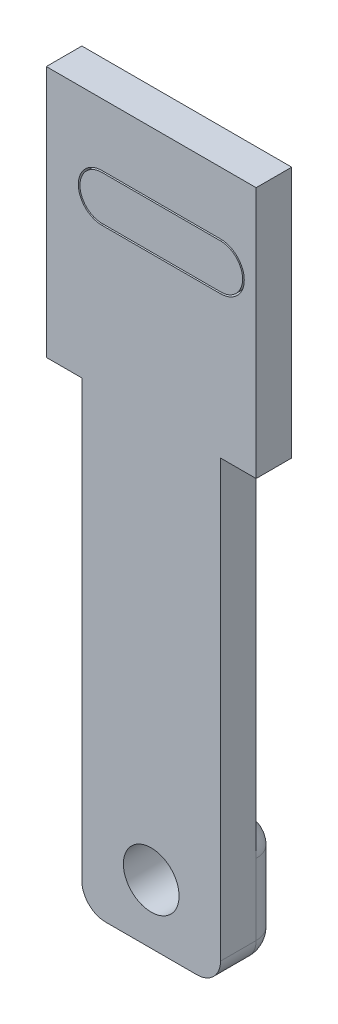
ISO-10303-21;
HEADER;
FILE_DESCRIPTION(('STEP AP214'),'2;1');
FILE_NAME('part.step','',(''),(''),'','','');
FILE_SCHEMA(('AUTOMOTIVE_DESIGN { 1 0 10303 214 1 1 1 1 }'));
ENDSEC;
DATA;
#1=APPLICATION_CONTEXT('core data for automotive mechanical design processes');
#2=APPLICATION_PROTOCOL_DEFINITION('international standard','automotive_design',2000,#1);
#3=PRODUCT_CONTEXT('',#1,'mechanical');
#4=PRODUCT('Part','Part','',(#3));
#5=PRODUCT_RELATED_PRODUCT_CATEGORY('part','',(#4));
#6=PRODUCT_DEFINITION_FORMATION('','',#4);
#7=PRODUCT_DEFINITION_CONTEXT('part definition',#1,'design');
#8=PRODUCT_DEFINITION('design','',#6,#7);
#9=PRODUCT_DEFINITION_SHAPE('','',#8);
#10=(LENGTH_UNIT() NAMED_UNIT(*) SI_UNIT(.MILLI.,.METRE.));
#11=(NAMED_UNIT(*) PLANE_ANGLE_UNIT() SI_UNIT($,.RADIAN.));
#12=(NAMED_UNIT(*) SI_UNIT($,.STERADIAN.) SOLID_ANGLE_UNIT());
#13=UNCERTAINTY_MEASURE_WITH_UNIT(LENGTH_MEASURE(1.E-05),#10,'distance_accuracy_value','');
#14=(GEOMETRIC_REPRESENTATION_CONTEXT(3) GLOBAL_UNCERTAINTY_ASSIGNED_CONTEXT((#13)) GLOBAL_UNIT_ASSIGNED_CONTEXT((#10,
#11,#12)) REPRESENTATION_CONTEXT('',''));
#15=CARTESIAN_POINT('',(0.,0.,0.));
#16=DIRECTION('',(0.,0.,1.));
#17=DIRECTION('',(1.,0.,0.));
#18=AXIS2_PLACEMENT_3D('',#15,#16,#17);
#19=CARTESIAN_POINT('',(-28.7142857142857,26.775974025974,1.25));
#20=DIRECTION('',(0.,0.,1.));
#21=DIRECTION('',(1.,0.,0.));
#22=AXIS2_PLACEMENT_3D('',#19,#20,#21);
#23=CYLINDRICAL_SURFACE('',#22,1.8617225645791);
#24=CARTESIAN_POINT('',(-28.7142857142857,26.775974025974,3.));
#25=DIRECTION('',(0.,0.,1.));
#26=DIRECTION('',(1.,0.,0.));
#27=AXIS2_PLACEMENT_3D('',#24,#25,#26);
#28=CIRCLE('',#27,1.8617225645791);
#29=CARTESIAN_POINT('',(-28.7142857142857,24.9142514613949,3.));
#30=VERTEX_POINT('',#29);
#31=CARTESIAN_POINT('',(-28.7142857142857,28.6376965905531,3.));
#32=VERTEX_POINT('',#31);
#33=EDGE_CURVE('E115',#30,#32,#28,.T.);
#34=ORIENTED_EDGE('',*,*,#33,.F.);
#35=DIRECTION('',(0.,0.,1.));
#36=VECTOR('',#35,1.);
#37=CARTESIAN_POINT('',(-28.7142857142857,24.9142514613949,1.25));
#38=LINE('',#37,#36);
#39=CARTESIAN_POINT('',(-28.7142857142857,24.9142514613949,1.25));
#40=VERTEX_POINT('',#39);
#41=EDGE_CURVE('E12',#40,#30,#38,.T.);
#42=ORIENTED_EDGE('',*,*,#41,.F.);
#43=CARTESIAN_POINT('',(-28.7142857142857,26.775974025974,1.25));
#44=DIRECTION('',(0.,0.,1.));
#45=DIRECTION('',(1.,0.,0.));
#46=AXIS2_PLACEMENT_3D('',#43,#44,#45);
#47=CIRCLE('',#46,1.8617225645791);
#48=CARTESIAN_POINT('',(-28.7142857142857,28.6376965905531,1.25));
#49=VERTEX_POINT('',#48);
#50=EDGE_CURVE('E109',#40,#49,#47,.T.);
#51=ORIENTED_EDGE('',*,*,#50,.T.);
#52=DIRECTION('',(0.,0.,1.));
#53=VECTOR('',#52,1.);
#54=CARTESIAN_POINT('',(-28.7142857142857,28.6376965905531,1.25));
#55=LINE('',#54,#53);
#56=EDGE_CURVE('E54',#49,#32,#55,.T.);
#57=ORIENTED_EDGE('',*,*,#56,.T.);
#58=EDGE_LOOP('',(#34,#42,#51,#57));
#59=FACE_BOUND('',#58,.T.);
#60=ADVANCED_FACE('F51',(#59),#23,.T.);
#61=CARTESIAN_POINT('',(-28.7142857142857,24.9142514613949,1.25));
#62=DIRECTION('',(0.,-1.,0.));
#63=DIRECTION('',(0.,0.,-1.));
#64=AXIS2_PLACEMENT_3D('',#61,#62,#63);
#65=PLANE('',#64);
#66=DIRECTION('',(1.,0.,0.));
#67=VECTOR('',#66,1.);
#68=CARTESIAN_POINT('',(-28.7142857142857,24.9142514613949,3.));
#69=LINE('',#68,#67);
#70=CARTESIAN_POINT('',(-38.7142857142857,24.9142514613949,3.));
#71=VERTEX_POINT('',#70);
#72=EDGE_CURVE('E111',#71,#30,#69,.T.);
#73=ORIENTED_EDGE('',*,*,#72,.F.);
#74=DIRECTION('',(0.,0.,1.));
#75=VECTOR('',#74,1.);
#76=CARTESIAN_POINT('',(-38.7142857142857,24.9142514613949,1.25));
#77=LINE('',#76,#75);
#78=CARTESIAN_POINT('',(-38.7142857142857,24.9142514613949,1.25));
#79=VERTEX_POINT('',#78);
#80=EDGE_CURVE('E60',#79,#71,#77,.T.);
#81=ORIENTED_EDGE('',*,*,#80,.F.);
#82=DIRECTION('',(1.,0.,0.));
#83=VECTOR('',#82,1.);
#84=CARTESIAN_POINT('',(-28.7142857142857,24.9142514613949,1.25));
#85=LINE('',#84,#83);
#86=EDGE_CURVE('E106',#79,#40,#85,.T.);
#87=ORIENTED_EDGE('',*,*,#86,.T.);
#88=ORIENTED_EDGE('',*,*,#41,.T.);
#89=EDGE_LOOP('',(#73,#81,#87,#88));
#90=FACE_BOUND('',#89,.T.);
#91=ADVANCED_FACE('F125',(#90),#65,.T.);
#92=CARTESIAN_POINT('',(-38.7142857142857,26.775974025974,1.25));
#93=DIRECTION('',(0.,0.,1.));
#94=DIRECTION('',(1.,0.,0.));
#95=AXIS2_PLACEMENT_3D('',#92,#93,#94);
#96=CYLINDRICAL_SURFACE('',#95,1.8617225645791);
#97=CARTESIAN_POINT('',(-38.7142857142857,26.775974025974,3.));
#98=DIRECTION('',(0.,0.,1.));
#99=DIRECTION('',(1.,0.,0.));
#100=AXIS2_PLACEMENT_3D('',#97,#98,#99);
#101=CIRCLE('',#100,1.8617225645791);
#102=CARTESIAN_POINT('',(-38.7142857142857,28.6376965905531,3.));
#103=VERTEX_POINT('',#102);
#104=EDGE_CURVE('E101',#103,#71,#101,.T.);
#105=ORIENTED_EDGE('',*,*,#104,.F.);
#106=DIRECTION('',(0.,0.,1.));
#107=VECTOR('',#106,1.);
#108=CARTESIAN_POINT('',(-38.7142857142857,28.6376965905531,1.25));
#109=LINE('',#108,#107);
#110=CARTESIAN_POINT('',(-38.7142857142857,28.6376965905531,1.25));
#111=VERTEX_POINT('',#110);
#112=EDGE_CURVE('E96',#111,#103,#109,.T.);
#113=ORIENTED_EDGE('',*,*,#112,.F.);
#114=CARTESIAN_POINT('',(-38.7142857142857,26.775974025974,1.25));
#115=DIRECTION('',(0.,0.,1.));
#116=DIRECTION('',(1.,0.,0.));
#117=AXIS2_PLACEMENT_3D('',#114,#115,#116);
#118=CIRCLE('',#117,1.8617225645791);
#119=EDGE_CURVE('E99',#111,#79,#118,.T.);
#120=ORIENTED_EDGE('',*,*,#119,.T.);
#121=ORIENTED_EDGE('',*,*,#80,.T.);
#122=EDGE_LOOP('',(#105,#113,#120,#121));
#123=FACE_BOUND('',#122,.T.);
#124=ADVANCED_FACE('F98',(#123),#96,.T.);
#125=CARTESIAN_POINT('',(-28.7142857142857,28.6376965905531,1.25));
#126=DIRECTION('',(0.,1.,0.));
#127=DIRECTION('',(0.,0.,1.));
#128=AXIS2_PLACEMENT_3D('',#125,#126,#127);
#129=PLANE('',#128);
#130=DIRECTION('',(-1.,0.,0.));
#131=VECTOR('',#130,1.);
#132=CARTESIAN_POINT('',(-28.7142857142857,28.6376965905531,3.));
#133=LINE('',#132,#131);
#134=EDGE_CURVE('E118',#32,#103,#133,.T.);
#135=ORIENTED_EDGE('',*,*,#134,.F.);
#136=ORIENTED_EDGE('',*,*,#56,.F.);
#137=DIRECTION('',(-1.,0.,0.));
#138=VECTOR('',#137,1.);
#139=CARTESIAN_POINT('',(-28.7142857142857,28.6376965905531,1.25));
#140=LINE('',#139,#138);
#141=EDGE_CURVE('E105',#49,#111,#140,.T.);
#142=ORIENTED_EDGE('',*,*,#141,.T.);
#143=ORIENTED_EDGE('',*,*,#112,.T.);
#144=EDGE_LOOP('',(#135,#136,#142,#143));
#145=FACE_BOUND('',#144,.T.);
#146=ADVANCED_FACE('F108',(#145),#129,.T.);
#147=CARTESIAN_POINT('',(-28.7142857142857,26.775974025974,1.25));
#148=DIRECTION('',(0.,0.,1.));
#149=DIRECTION('',(1.,0.,0.));
#150=AXIS2_PLACEMENT_3D('',#147,#148,#149);
#151=PLANE('',#150);
#152=ORIENTED_EDGE('',*,*,#50,.F.);
#153=ORIENTED_EDGE('',*,*,#86,.F.);
#154=ORIENTED_EDGE('',*,*,#119,.F.);
#155=ORIENTED_EDGE('',*,*,#141,.F.);
#156=EDGE_LOOP('',(#152,#153,#154,#155));
#157=FACE_BOUND('',#156,.T.);
#158=ADVANCED_FACE('F104',(#157),#151,.F.);
#159=CARTESIAN_POINT('',(-28.7142857142857,26.775974025974,3.));
#160=DIRECTION('',(0.,0.,1.));
#161=DIRECTION('',(1.,0.,0.));
#162=AXIS2_PLACEMENT_3D('',#159,#160,#161);
#163=PLANE('',#162);
#164=ORIENTED_EDGE('',*,*,#33,.T.);
#165=ORIENTED_EDGE('',*,*,#134,.T.);
#166=ORIENTED_EDGE('',*,*,#104,.T.);
#167=ORIENTED_EDGE('',*,*,#72,.T.);
#168=EDGE_LOOP('',(#164,#165,#166,#167));
#169=FACE_BOUND('',#168,.T.);
#170=ADVANCED_FACE('F124',(#169),#163,.T.);
#171=CLOSED_SHELL('',(#60,#91,#124,#146,#158,#170));
#172=MANIFOLD_SOLID_BREP('B2',#171);
#173=CARTESIAN_POINT('',(0.,0.,0.));
#174=DIRECTION('',(0.,0.,1.));
#175=DIRECTION('',(1.,0.,0.));
#176=AXIS2_PLACEMENT_3D('',#173,#174,#175);
#177=PLANE('',#176);
#178=DIRECTION('',(1.,0.,0.));
#179=VECTOR('',#178,1.);
#180=CARTESIAN_POINT('',(-28.7142857142857,25.525974025974,0.));
#181=LINE('',#180,#179);
#182=CARTESIAN_POINT('',(-38.7142857142857,25.525974025974,0.));
#183=VERTEX_POINT('',#182);
#184=CARTESIAN_POINT('',(-28.7142857142857,25.525974025974,0.));
#185=VERTEX_POINT('',#184);
#186=EDGE_CURVE('E410',#183,#185,#181,.T.);
#187=ORIENTED_EDGE('',*,*,#186,.T.);
#188=CARTESIAN_POINT('',(-28.7142857142857,26.775974025974,0.));
#189=DIRECTION('',(0.,0.,1.));
#190=DIRECTION('',(1.,0.,0.));
#191=AXIS2_PLACEMENT_3D('',#188,#189,#190);
#192=CIRCLE('',#191,1.25);
#193=CARTESIAN_POINT('',(-28.7142857142857,28.025974025974,0.));
#194=VERTEX_POINT('',#193);
#195=EDGE_CURVE('E401',#185,#194,#192,.T.);
#196=ORIENTED_EDGE('',*,*,#195,.T.);
#197=DIRECTION('',(-1.,0.,0.));
#198=VECTOR('',#197,1.);
#199=CARTESIAN_POINT('',(-28.7142857142857,28.025974025974,0.));
#200=LINE('',#199,#198);
#201=CARTESIAN_POINT('',(-38.7142857142857,28.025974025974,0.));
#202=VERTEX_POINT('',#201);
#203=EDGE_CURVE('E404',#194,#202,#200,.T.);
#204=ORIENTED_EDGE('',*,*,#203,.T.);
#205=CARTESIAN_POINT('',(-38.7142857142857,26.775974025974,0.));
#206=DIRECTION('',(0.,0.,1.));
#207=DIRECTION('',(1.,0.,0.));
#208=AXIS2_PLACEMENT_3D('',#205,#206,#207);
#209=CIRCLE('',#208,1.25);
#210=EDGE_CURVE('E407',#202,#183,#209,.T.);
#211=ORIENTED_EDGE('',*,*,#210,.T.);
#212=EDGE_LOOP('',(#187,#196,#204,#211));
#213=FACE_BOUND('',#212,.T.);
#214=DIRECTION('',(1.,0.,0.));
#215=VECTOR('',#214,1.);
#216=CARTESIAN_POINT('',(-28.7142857142857,-15.974025974026,0.));
#217=LINE('',#216,#215);
#218=CARTESIAN_POINT('',(-38.4142857142857,-15.974025974026,0.));
#219=VERTEX_POINT('',#218);
#220=CARTESIAN_POINT('',(-30.7142857142857,-15.974025974026,0.));
#221=VERTEX_POINT('',#220);
#222=EDGE_CURVE('E380',#219,#221,#217,.T.);
#223=ORIENTED_EDGE('',*,*,#222,.F.);
#224=CARTESIAN_POINT('',(-38.4142857142857,-17.974025974026,0.));
#225=DIRECTION('',(0.,0.,1.));
#226=DIRECTION('',(1.,0.,0.));
#227=AXIS2_PLACEMENT_3D('',#224,#225,#226);
#228=CIRCLE('',#227,2.);
#229=CARTESIAN_POINT('',(-40.4142857142857,-17.974025974026,0.));
#230=VERTEX_POINT('',#229);
#231=EDGE_CURVE('E49',#219,#230,#228,.T.);
#232=ORIENTED_EDGE('',*,*,#231,.T.);
#233=DIRECTION('',(0.,1.,0.));
#234=VECTOR('',#233,1.);
#235=CARTESIAN_POINT('',(-40.4142857142857,-25.974025974026,0.));
#236=LINE('',#235,#234);
#237=CARTESIAN_POINT('',(-40.4142857142857,12.775974025974,0.));
#238=VERTEX_POINT('',#237);
#239=EDGE_CURVE('E426',#230,#238,#236,.T.);
#240=ORIENTED_EDGE('',*,*,#239,.T.);
#241=DIRECTION('',(-1.,0.,0.));
#242=VECTOR('',#241,1.);
#243=CARTESIAN_POINT('',(-43.4142857142857,12.775974025974,0.));
#244=LINE('',#243,#242);
#245=CARTESIAN_POINT('',(-43.4142857142857,12.775974025974,0.));
#246=VERTEX_POINT('',#245);
#247=EDGE_CURVE('E428',#238,#246,#244,.T.);
#248=ORIENTED_EDGE('',*,*,#247,.T.);
#249=DIRECTION('',(0.,-1.,0.));
#250=VECTOR('',#249,1.);
#251=CARTESIAN_POINT('',(-43.4142857142857,34.025974025974,0.));
#252=LINE('',#251,#250);
#253=CARTESIAN_POINT('',(-43.4142857142857,34.025974025974,0.));
#254=VERTEX_POINT('',#253);
#255=EDGE_CURVE('E440',#254,#246,#252,.T.);
#256=ORIENTED_EDGE('',*,*,#255,.F.);
#257=DIRECTION('',(-1.,0.,0.));
#258=VECTOR('',#257,1.);
#259=CARTESIAN_POINT('',(-43.4142857142857,34.025974025974,0.));
#260=LINE('',#259,#258);
#261=CARTESIAN_POINT('',(-25.7142857142857,34.025974025974,0.));
#262=VERTEX_POINT('',#261);
#263=EDGE_CURVE('E460',#262,#254,#260,.T.);
#264=ORIENTED_EDGE('',*,*,#263,.F.);
#265=DIRECTION('',(0.,1.,0.));
#266=VECTOR('',#265,1.);
#267=CARTESIAN_POINT('',(-25.7142857142857,34.025974025974,0.));
#268=LINE('',#267,#266);
#269=CARTESIAN_POINT('',(-25.7142857142857,12.775974025974,0.));
#270=VERTEX_POINT('',#269);
#271=EDGE_CURVE('E469',#270,#262,#268,.T.);
#272=ORIENTED_EDGE('',*,*,#271,.F.);
#273=DIRECTION('',(-1.,0.,0.));
#274=VECTOR('',#273,1.);
#275=CARTESIAN_POINT('',(-25.7142857142857,12.775974025974,0.));
#276=LINE('',#275,#274);
#277=CARTESIAN_POINT('',(-28.7142857142857,12.775974025974,0.));
#278=VERTEX_POINT('',#277);
#279=EDGE_CURVE('E450',#270,#278,#276,.T.);
#280=ORIENTED_EDGE('',*,*,#279,.T.);
#281=DIRECTION('',(0.,-1.,0.));
#282=VECTOR('',#281,1.);
#283=CARTESIAN_POINT('',(-28.7142857142857,-25.974025974026,0.));
#284=LINE('',#283,#282);
#285=CARTESIAN_POINT('',(-28.7142857142857,-17.974025974026,0.));
#286=VERTEX_POINT('',#285);
#287=EDGE_CURVE('E445',#278,#286,#284,.T.);
#288=ORIENTED_EDGE('',*,*,#287,.T.);
#289=CARTESIAN_POINT('',(-30.7142857142857,-17.974025974026,0.));
#290=DIRECTION('',(0.,0.,1.));
#291=DIRECTION('',(1.,0.,0.));
#292=AXIS2_PLACEMENT_3D('',#289,#290,#291);
#293=CIRCLE('',#292,2.);
#294=EDGE_CURVE('E508',#286,#221,#293,.T.);
#295=ORIENTED_EDGE('',*,*,#294,.T.);
#296=EDGE_LOOP('',(#223,#232,#240,#248,#256,#264,#272,#280,#288,#295));
#297=FACE_BOUND('',#296,.T.);
#298=ADVANCED_FACE('F198',(#213,#297),#177,.F.);
#299=CARTESIAN_POINT('',(-28.7142857142857,26.775974025974,0.));
#300=DIRECTION('',(0.,0.,1.));
#301=DIRECTION('',(1.,0.,0.));
#302=AXIS2_PLACEMENT_3D('',#299,#300,#301);
#303=CYLINDRICAL_SURFACE('',#302,1.25);
#304=CARTESIAN_POINT('',(-28.7142857142857,26.775974025974,1.));
#305=DIRECTION('',(0.,0.,1.));
#306=DIRECTION('',(1.,0.,0.));
#307=AXIS2_PLACEMENT_3D('',#304,#305,#306);
#308=CIRCLE('',#307,1.25);
#309=CARTESIAN_POINT('',(-28.7142857142857,28.025974025974,1.));
#310=VERTEX_POINT('',#309);
#311=CARTESIAN_POINT('',(-28.7142857142857,25.525974025974,1.));
#312=VERTEX_POINT('',#311);
#313=EDGE_CURVE('E399',#310,#312,#308,.F.);
#314=ORIENTED_EDGE('',*,*,#313,.F.);
#315=DIRECTION('',(0.,0.,1.));
#316=VECTOR('',#315,1.);
#317=CARTESIAN_POINT('',(-28.7142857142857,28.025974025974,0.));
#318=LINE('',#317,#316);
#319=EDGE_CURVE('E413',#194,#310,#318,.T.);
#320=ORIENTED_EDGE('',*,*,#319,.F.);
#321=ORIENTED_EDGE('',*,*,#195,.F.);
#322=DIRECTION('',(0.,0.,1.));
#323=VECTOR('',#322,1.);
#324=CARTESIAN_POINT('',(-28.7142857142857,25.525974025974,0.));
#325=LINE('',#324,#323);
#326=EDGE_CURVE('E414',#185,#312,#325,.T.);
#327=ORIENTED_EDGE('',*,*,#326,.T.);
#328=EDGE_LOOP('',(#314,#320,#321,#327));
#329=FACE_BOUND('',#328,.T.);
#330=ADVANCED_FACE('F624',(#329),#303,.F.);
#331=CARTESIAN_POINT('',(-28.7142857142857,25.525974025974,0.));
#332=DIRECTION('',(0.,-1.,0.));
#333=DIRECTION('',(0.,0.,-1.));
#334=AXIS2_PLACEMENT_3D('',#331,#332,#333);
#335=PLANE('',#334);
#336=DIRECTION('',(-1.,0.,0.));
#337=VECTOR('',#336,1.);
#338=CARTESIAN_POINT('',(-28.7142857142857,25.525974025974,1.));
#339=LINE('',#338,#337);
#340=CARTESIAN_POINT('',(-38.7142857142857,25.525974025974,1.));
#341=VERTEX_POINT('',#340);
#342=EDGE_CURVE('E397',#312,#341,#339,.T.);
#343=ORIENTED_EDGE('',*,*,#342,.F.);
#344=ORIENTED_EDGE('',*,*,#326,.F.);
#345=ORIENTED_EDGE('',*,*,#186,.F.);
#346=DIRECTION('',(0.,0.,1.));
#347=VECTOR('',#346,1.);
#348=CARTESIAN_POINT('',(-38.7142857142857,25.525974025974,0.));
#349=LINE('',#348,#347);
#350=EDGE_CURVE('E418',#183,#341,#349,.T.);
#351=ORIENTED_EDGE('',*,*,#350,.T.);
#352=EDGE_LOOP('',(#343,#344,#345,#351));
#353=FACE_BOUND('',#352,.T.);
#354=ADVANCED_FACE('F629',(#353),#335,.F.);
#355=CARTESIAN_POINT('',(-38.7142857142857,26.775974025974,0.));
#356=DIRECTION('',(0.,0.,1.));
#357=DIRECTION('',(1.,0.,0.));
#358=AXIS2_PLACEMENT_3D('',#355,#356,#357);
#359=CYLINDRICAL_SURFACE('',#358,1.25);
#360=CARTESIAN_POINT('',(-38.7142857142857,26.775974025974,1.));
#361=DIRECTION('',(0.,0.,1.));
#362=DIRECTION('',(1.,0.,0.));
#363=AXIS2_PLACEMENT_3D('',#360,#361,#362);
#364=CIRCLE('',#363,1.25);
#365=CARTESIAN_POINT('',(-38.7142857142857,28.025974025974,1.));
#366=VERTEX_POINT('',#365);
#367=EDGE_CURVE('E392',#341,#366,#364,.F.);
#368=ORIENTED_EDGE('',*,*,#367,.F.);
#369=ORIENTED_EDGE('',*,*,#350,.F.);
#370=ORIENTED_EDGE('',*,*,#210,.F.);
#371=DIRECTION('',(0.,0.,1.));
#372=VECTOR('',#371,1.);
#373=CARTESIAN_POINT('',(-38.7142857142857,28.025974025974,0.));
#374=LINE('',#373,#372);
#375=EDGE_CURVE('E421',#202,#366,#374,.T.);
#376=ORIENTED_EDGE('',*,*,#375,.T.);
#377=EDGE_LOOP('',(#368,#369,#370,#376));
#378=FACE_BOUND('',#377,.T.);
#379=ADVANCED_FACE('F644',(#378),#359,.F.);
#380=CARTESIAN_POINT('',(-28.7142857142857,28.025974025974,0.));
#381=DIRECTION('',(0.,1.,0.));
#382=DIRECTION('',(-1.,0.,0.));
#383=AXIS2_PLACEMENT_3D('',#380,#381,#382);
#384=PLANE('',#383);
#385=DIRECTION('',(1.,0.,0.));
#386=VECTOR('',#385,1.);
#387=CARTESIAN_POINT('',(-28.7142857142857,28.025974025974,1.));
#388=LINE('',#387,#386);
#389=EDGE_CURVE('E477',#366,#310,#388,.T.);
#390=ORIENTED_EDGE('',*,*,#389,.F.);
#391=ORIENTED_EDGE('',*,*,#375,.F.);
#392=ORIENTED_EDGE('',*,*,#203,.F.);
#393=ORIENTED_EDGE('',*,*,#319,.T.);
#394=EDGE_LOOP('',(#390,#391,#392,#393));
#395=FACE_BOUND('',#394,.T.);
#396=ADVANCED_FACE('F641',(#395),#384,.F.);
#397=CARTESIAN_POINT('',(-43.4142857142857,34.025974025974,3.));
#398=DIRECTION('',(1.,0.,0.));
#399=DIRECTION('',(0.,1.,0.));
#400=AXIS2_PLACEMENT_3D('',#397,#398,#399);
#401=PLANE('',#400);
#402=ORIENTED_EDGE('',*,*,#255,.T.);
#403=DIRECTION('',(0.,0.,1.));
#404=VECTOR('',#403,1.);
#405=CARTESIAN_POINT('',(-43.4142857142857,12.775974025974,0.));
#406=LINE('',#405,#404);
#407=CARTESIAN_POINT('',(-43.4142857142857,12.775974025974,3.));
#408=VERTEX_POINT('',#407);
#409=EDGE_CURVE('E437',#246,#408,#406,.T.);
#410=ORIENTED_EDGE('',*,*,#409,.T.);
#411=DIRECTION('',(0.,-1.,0.));
#412=VECTOR('',#411,1.);
#413=CARTESIAN_POINT('',(-43.4142857142857,34.025974025974,3.));
#414=LINE('',#413,#412);
#415=CARTESIAN_POINT('',(-43.4142857142857,34.025974025974,3.));
#416=VERTEX_POINT('',#415);
#417=EDGE_CURVE('E456',#416,#408,#414,.T.);
#418=ORIENTED_EDGE('',*,*,#417,.F.);
#419=DIRECTION('',(0.,0.,-1.));
#420=VECTOR('',#419,1.);
#421=CARTESIAN_POINT('',(-43.4142857142857,34.025974025974,3.));
#422=LINE('',#421,#420);
#423=EDGE_CURVE('E466',#416,#254,#422,.T.);
#424=ORIENTED_EDGE('',*,*,#423,.T.);
#425=EDGE_LOOP('',(#402,#410,#418,#424));
#426=FACE_BOUND('',#425,.T.);
#427=ADVANCED_FACE('F558',(#426),#401,.F.);
#428=CARTESIAN_POINT('',(-43.4142857142857,-25.974025974026,3.));
#429=DIRECTION('',(0.,1.,0.));
#430=DIRECTION('',(0.,0.,1.));
#431=AXIS2_PLACEMENT_3D('',#428,#429,#430);
#432=PLANE('',#431);
#433=DIRECTION('',(1.,0.,0.));
#434=VECTOR('',#433,1.);
#435=CARTESIAN_POINT('',(-43.4142857142857,-25.974025974026,3.));
#436=LINE('',#435,#434);
#437=CARTESIAN_POINT('',(-38.4142857142857,-25.974025974026,3.));
#438=VERTEX_POINT('',#437);
#439=CARTESIAN_POINT('',(-30.7142857142857,-25.974025974026,3.));
#440=VERTEX_POINT('',#439);
#441=EDGE_CURVE('E459',#438,#440,#436,.T.);
#442=ORIENTED_EDGE('',*,*,#441,.F.);
#443=DIRECTION('',(0.,0.,1.));
#444=VECTOR('',#443,1.);
#445=CARTESIAN_POINT('',(-38.4142857142857,-25.974025974026,3.));
#446=LINE('',#445,#444);
#447=CARTESIAN_POINT('',(-38.4142857142857,-25.974025974026,0.));
#448=VERTEX_POINT('',#447);
#449=EDGE_CURVE('E207',#438,#448,#446,.F.);
#450=ORIENTED_EDGE('',*,*,#449,.T.);
#451=DIRECTION('',(-1.,0.,0.));
#452=VECTOR('',#451,1.);
#453=CARTESIAN_POINT('',(-43.4142857142857,-25.974025974026,0.));
#454=LINE('',#453,#452);
#455=CARTESIAN_POINT('',(-30.7142857142857,-25.974025974026,0.));
#456=VERTEX_POINT('',#455);
#457=EDGE_CURVE('E486',#448,#456,#454,.F.);
#458=ORIENTED_EDGE('',*,*,#457,.T.);
#459=DIRECTION('',(0.,0.,1.));
#460=VECTOR('',#459,1.);
#461=CARTESIAN_POINT('',(-30.7142857142857,-25.974025974026,3.));
#462=LINE('',#461,#460);
#463=EDGE_CURVE('E503',#456,#440,#462,.T.);
#464=ORIENTED_EDGE('',*,*,#463,.T.);
#465=EDGE_LOOP('',(#442,#450,#458,#464));
#466=FACE_BOUND('',#465,.T.);
#467=ADVANCED_FACE('F597',(#466),#432,.F.);
#468=CARTESIAN_POINT('',(-25.7142857142857,34.025974025974,3.));
#469=DIRECTION('',(-1.,0.,0.));
#470=DIRECTION('',(0.,-1.,0.));
#471=AXIS2_PLACEMENT_3D('',#468,#469,#470);
#472=PLANE('',#471);
#473=DIRECTION('',(0.,1.,0.));
#474=VECTOR('',#473,1.);
#475=CARTESIAN_POINT('',(-25.7142857142857,34.025974025974,3.));
#476=LINE('',#475,#474);
#477=CARTESIAN_POINT('',(-25.7142857142857,12.775974025974,3.));
#478=VERTEX_POINT('',#477);
#479=CARTESIAN_POINT('',(-25.7142857142857,34.025974025974,3.));
#480=VERTEX_POINT('',#479);
#481=EDGE_CURVE('E462',#478,#480,#476,.T.);
#482=ORIENTED_EDGE('',*,*,#481,.F.);
#483=DIRECTION('',(0.,0.,1.));
#484=VECTOR('',#483,1.);
#485=CARTESIAN_POINT('',(-25.7142857142857,12.775974025974,0.));
#486=LINE('',#485,#484);
#487=EDGE_CURVE('E443',#270,#478,#486,.T.);
#488=ORIENTED_EDGE('',*,*,#487,.F.);
#489=ORIENTED_EDGE('',*,*,#271,.T.);
#490=DIRECTION('',(0.,0.,-1.));
#491=VECTOR('',#490,1.);
#492=CARTESIAN_POINT('',(-25.7142857142857,34.025974025974,3.));
#493=LINE('',#492,#491);
#494=EDGE_CURVE('E474',#480,#262,#493,.T.);
#495=ORIENTED_EDGE('',*,*,#494,.F.);
#496=EDGE_LOOP('',(#482,#488,#489,#495));
#497=FACE_BOUND('',#496,.T.);
#498=ADVANCED_FACE('F609',(#497),#472,.F.);
#499=CARTESIAN_POINT('',(-43.4142857142857,34.025974025974,3.));
#500=DIRECTION('',(0.,-1.,0.));
#501=DIRECTION('',(0.,0.,-1.));
#502=AXIS2_PLACEMENT_3D('',#499,#500,#501);
#503=PLANE('',#502);
#504=ORIENTED_EDGE('',*,*,#263,.T.);
#505=ORIENTED_EDGE('',*,*,#423,.F.);
#506=DIRECTION('',(-1.,0.,0.));
#507=VECTOR('',#506,1.);
#508=CARTESIAN_POINT('',(-43.4142857142857,34.025974025974,3.));
#509=LINE('',#508,#507);
#510=EDGE_CURVE('E464',#480,#416,#509,.T.);
#511=ORIENTED_EDGE('',*,*,#510,.F.);
#512=ORIENTED_EDGE('',*,*,#494,.T.);
#513=EDGE_LOOP('',(#504,#505,#511,#512));
#514=FACE_BOUND('',#513,.T.);
#515=ADVANCED_FACE('F612',(#514),#503,.F.);
#516=CARTESIAN_POINT('',(0.,0.,3.));
#517=DIRECTION('',(0.,0.,1.));
#518=DIRECTION('',(1.,0.,0.));
#519=AXIS2_PLACEMENT_3D('',#516,#517,#518);
#520=PLANE('',#519);
#521=CARTESIAN_POINT('',(-34.5642857142857,-20.974025974026,3.));
#522=DIRECTION('',(0.,0.,-1.));
#523=DIRECTION('',(-1.,0.,0.));
#524=AXIS2_PLACEMENT_3D('',#521,#522,#523);
#525=CIRCLE('',#524,2.35);
#526=CARTESIAN_POINT('',(-36.9142857142857,-20.974025974026,3.));
#527=VERTEX_POINT('',#526);
#528=EDGE_CURVE('E483',#527,#527,#525,.T.);
#529=ORIENTED_EDGE('',*,*,#528,.T.);
#530=EDGE_LOOP('',(#529));
#531=FACE_BOUND('',#530,.T.);
#532=CARTESIAN_POINT('',(-38.7142857142857,26.775974025974,3.));
#533=DIRECTION('',(0.,0.,1.));
#534=DIRECTION('',(1.,0.,0.));
#535=AXIS2_PLACEMENT_3D('',#532,#533,#534);
#536=CIRCLE('',#535,2.);
#537=CARTESIAN_POINT('',(-38.7142857142857,28.775974025974,3.));
#538=VERTEX_POINT('',#537);
#539=CARTESIAN_POINT('',(-38.7142857142857,24.775974025974,3.));
#540=VERTEX_POINT('',#539);
#541=EDGE_CURVE('E356',#538,#540,#536,.T.);
#542=ORIENTED_EDGE('',*,*,#541,.F.);
#543=DIRECTION('',(-1.,0.,0.));
#544=VECTOR('',#543,1.);
#545=CARTESIAN_POINT('',(-38.7142857142857,28.775974025974,3.));
#546=LINE('',#545,#544);
#547=CARTESIAN_POINT('',(-28.7142857142857,28.775974025974,3.));
#548=VERTEX_POINT('',#547);
#549=EDGE_CURVE('E374',#548,#538,#546,.T.);
#550=ORIENTED_EDGE('',*,*,#549,.F.);
#551=CARTESIAN_POINT('',(-28.7142857142857,26.775974025974,3.));
#552=DIRECTION('',(0.,0.,1.));
#553=DIRECTION('',(1.,0.,0.));
#554=AXIS2_PLACEMENT_3D('',#551,#552,#553);
#555=CIRCLE('',#554,2.);
#556=CARTESIAN_POINT('',(-28.7142857142857,24.775974025974,3.));
#557=VERTEX_POINT('',#556);
#558=EDGE_CURVE('E377',#557,#548,#555,.T.);
#559=ORIENTED_EDGE('',*,*,#558,.F.);
#560=DIRECTION('',(1.,0.,0.));
#561=VECTOR('',#560,1.);
#562=CARTESIAN_POINT('',(-38.7142857142857,24.775974025974,3.));
#563=LINE('',#562,#561);
#564=EDGE_CURVE('E386',#540,#557,#563,.T.);
#565=ORIENTED_EDGE('',*,*,#564,.F.);
#566=EDGE_LOOP('',(#542,#550,#559,#565));
#567=FACE_BOUND('',#566,.T.);
#568=DIRECTION('',(0.,1.,0.));
#569=VECTOR('',#568,1.);
#570=CARTESIAN_POINT('',(-40.4142857142857,-25.974025974026,3.));
#571=LINE('',#570,#569);
#572=CARTESIAN_POINT('',(-40.4142857142857,-23.974025974026,3.));
#573=VERTEX_POINT('',#572);
#574=CARTESIAN_POINT('',(-40.4142857142857,12.775974025974,3.));
#575=VERTEX_POINT('',#574);
#576=EDGE_CURVE('E433',#573,#575,#571,.T.);
#577=ORIENTED_EDGE('',*,*,#576,.F.);
#578=CARTESIAN_POINT('',(-38.4142857142857,-23.974025974026,3.));
#579=DIRECTION('',(0.,0.,1.));
#580=DIRECTION('',(1.,0.,0.));
#581=AXIS2_PLACEMENT_3D('',#578,#579,#580);
#582=CIRCLE('',#581,2.);
#583=EDGE_CURVE('E215',#573,#438,#582,.T.);
#584=ORIENTED_EDGE('',*,*,#583,.T.);
#585=ORIENTED_EDGE('',*,*,#441,.T.);
#586=CARTESIAN_POINT('',(-30.7142857142857,-23.974025974026,3.));
#587=DIRECTION('',(0.,0.,1.));
#588=DIRECTION('',(1.,0.,0.));
#589=AXIS2_PLACEMENT_3D('',#586,#587,#588);
#590=CIRCLE('',#589,2.);
#591=CARTESIAN_POINT('',(-28.7142857142857,-23.974025974026,3.));
#592=VERTEX_POINT('',#591);
#593=EDGE_CURVE('E506',#440,#592,#590,.T.);
#594=ORIENTED_EDGE('',*,*,#593,.T.);
#595=DIRECTION('',(0.,-1.,0.));
#596=VECTOR('',#595,1.);
#597=CARTESIAN_POINT('',(-28.7142857142857,-25.974025974026,3.));
#598=LINE('',#597,#596);
#599=CARTESIAN_POINT('',(-28.7142857142857,12.775974025974,3.));
#600=VERTEX_POINT('',#599);
#601=EDGE_CURVE('E447',#600,#592,#598,.T.);
#602=ORIENTED_EDGE('',*,*,#601,.F.);
#603=DIRECTION('',(-1.,0.,0.));
#604=VECTOR('',#603,1.);
#605=CARTESIAN_POINT('',(-25.7142857142857,12.775974025974,3.));
#606=LINE('',#605,#604);
#607=EDGE_CURVE('E435',#478,#600,#606,.T.);
#608=ORIENTED_EDGE('',*,*,#607,.F.);
#609=ORIENTED_EDGE('',*,*,#481,.T.);
#610=ORIENTED_EDGE('',*,*,#510,.T.);
#611=ORIENTED_EDGE('',*,*,#417,.T.);
#612=DIRECTION('',(-1.,0.,0.));
#613=VECTOR('',#612,1.);
#614=CARTESIAN_POINT('',(-43.4142857142857,12.775974025974,3.));
#615=LINE('',#614,#613);
#616=EDGE_CURVE('E429',#575,#408,#615,.T.);
#617=ORIENTED_EDGE('',*,*,#616,.F.);
#618=EDGE_LOOP('',(#577,#584,#585,#594,#602,#608,#609,#610,#611,#617));
#619=FACE_BOUND('',#618,.T.);
#620=ADVANCED_FACE('F552',(#531,#567,#619),#520,.T.);
#621=CARTESIAN_POINT('',(-28.7142857142857,-25.974025974026,0.));
#622=DIRECTION('',(-1.,0.,0.));
#623=DIRECTION('',(0.,0.,1.));
#624=AXIS2_PLACEMENT_3D('',#621,#622,#623);
#625=PLANE('',#624);
#626=DIRECTION('',(0.,-1.,0.));
#627=VECTOR('',#626,1.);
#628=CARTESIAN_POINT('',(-28.7142857142857,-25.974025974026,0.));
#629=LINE('',#628,#627);
#630=CARTESIAN_POINT('',(-28.7142857142857,-23.974025974026,0.));
#631=VERTEX_POINT('',#630);
#632=EDGE_CURVE('E492',#631,#286,#629,.F.);
#633=ORIENTED_EDGE('',*,*,#632,.T.);
#634=ORIENTED_EDGE('',*,*,#287,.F.);
#635=DIRECTION('',(0.,0.,1.));
#636=VECTOR('',#635,1.);
#637=CARTESIAN_POINT('',(-28.7142857142857,12.775974025974,0.));
#638=LINE('',#637,#636);
#639=EDGE_CURVE('E417',#278,#600,#638,.T.);
#640=ORIENTED_EDGE('',*,*,#639,.T.);
#641=ORIENTED_EDGE('',*,*,#601,.T.);
#642=DIRECTION('',(0.,0.,1.));
#643=VECTOR('',#642,1.);
#644=CARTESIAN_POINT('',(-28.7142857142857,-23.974025974026,0.));
#645=LINE('',#644,#643);
#646=EDGE_CURVE('E490',#592,#631,#645,.F.);
#647=ORIENTED_EDGE('',*,*,#646,.T.);
#648=EDGE_LOOP('',(#633,#634,#640,#641,#647));
#649=FACE_BOUND('',#648,.T.);
#650=ADVANCED_FACE('F601',(#649),#625,.F.);
#651=CARTESIAN_POINT('',(-25.7142857142857,12.775974025974,0.));
#652=DIRECTION('',(0.,1.,0.));
#653=DIRECTION('',(-1.,0.,0.));
#654=AXIS2_PLACEMENT_3D('',#651,#652,#653);
#655=PLANE('',#654);
#656=ORIENTED_EDGE('',*,*,#607,.T.);
#657=ORIENTED_EDGE('',*,*,#639,.F.);
#658=ORIENTED_EDGE('',*,*,#279,.F.);
#659=ORIENTED_EDGE('',*,*,#487,.T.);
#660=EDGE_LOOP('',(#656,#657,#658,#659));
#661=FACE_BOUND('',#660,.T.);
#662=ADVANCED_FACE('F604',(#661),#655,.F.);
#663=CARTESIAN_POINT('',(-43.4142857142857,12.775974025974,0.));
#664=DIRECTION('',(0.,1.,0.));
#665=DIRECTION('',(0.,0.,1.));
#666=AXIS2_PLACEMENT_3D('',#663,#664,#665);
#667=PLANE('',#666);
#668=ORIENTED_EDGE('',*,*,#616,.T.);
#669=ORIENTED_EDGE('',*,*,#409,.F.);
#670=ORIENTED_EDGE('',*,*,#247,.F.);
#671=DIRECTION('',(0.,0.,1.));
#672=VECTOR('',#671,1.);
#673=CARTESIAN_POINT('',(-40.4142857142857,12.775974025974,0.));
#674=LINE('',#673,#672);
#675=EDGE_CURVE('E432',#238,#575,#674,.T.);
#676=ORIENTED_EDGE('',*,*,#675,.T.);
#677=EDGE_LOOP('',(#668,#669,#670,#676));
#678=FACE_BOUND('',#677,.T.);
#679=ADVANCED_FACE('F555',(#678),#667,.F.);
#680=CARTESIAN_POINT('',(-40.4142857142857,-25.974025974026,0.));
#681=DIRECTION('',(1.,0.,0.));
#682=DIRECTION('',(0.,0.,-1.));
#683=AXIS2_PLACEMENT_3D('',#680,#681,#682);
#684=PLANE('',#683);
#685=ORIENTED_EDGE('',*,*,#239,.F.);
#686=DIRECTION('',(0.,1.,0.));
#687=VECTOR('',#686,1.);
#688=CARTESIAN_POINT('',(-40.4142857142857,-25.974025974026,0.));
#689=LINE('',#688,#687);
#690=CARTESIAN_POINT('',(-40.4142857142857,-23.974025974026,0.));
#691=VERTEX_POINT('',#690);
#692=EDGE_CURVE('E525',#230,#691,#689,.F.);
#693=ORIENTED_EDGE('',*,*,#692,.T.);
#694=DIRECTION('',(0.,0.,1.));
#695=VECTOR('',#694,1.);
#696=CARTESIAN_POINT('',(-40.4142857142857,-23.974025974026,0.));
#697=LINE('',#696,#695);
#698=EDGE_CURVE('E523',#691,#573,#697,.T.);
#699=ORIENTED_EDGE('',*,*,#698,.T.);
#700=ORIENTED_EDGE('',*,*,#576,.T.);
#701=ORIENTED_EDGE('',*,*,#675,.F.);
#702=EDGE_LOOP('',(#685,#693,#699,#700,#701));
#703=FACE_BOUND('',#702,.T.);
#704=ADVANCED_FACE('F549',(#703),#684,.F.);
#705=CARTESIAN_POINT('',(-38.7142857142857,26.775974025974,1.));
#706=DIRECTION('',(0.,0.,1.));
#707=DIRECTION('',(1.,0.,0.));
#708=AXIS2_PLACEMENT_3D('',#705,#706,#707);
#709=PLANE('',#708);
#710=CARTESIAN_POINT('',(-38.7142857142857,26.775974025974,1.));
#711=DIRECTION('',(0.,0.,1.));
#712=DIRECTION('',(1.,0.,0.));
#713=AXIS2_PLACEMENT_3D('',#710,#711,#712);
#714=CIRCLE('',#713,2.);
#715=CARTESIAN_POINT('',(-38.7142857142857,28.775974025974,1.));
#716=VERTEX_POINT('',#715);
#717=CARTESIAN_POINT('',(-38.7142857142857,24.775974025974,1.));
#718=VERTEX_POINT('',#717);
#719=EDGE_CURVE('E353',#716,#718,#714,.T.);
#720=ORIENTED_EDGE('',*,*,#719,.T.);
#721=DIRECTION('',(1.,0.,0.));
#722=VECTOR('',#721,1.);
#723=CARTESIAN_POINT('',(-38.7142857142857,24.775974025974,1.));
#724=LINE('',#723,#722);
#725=CARTESIAN_POINT('',(-28.7142857142857,24.775974025974,1.));
#726=VERTEX_POINT('',#725);
#727=EDGE_CURVE('E364',#718,#726,#724,.T.);
#728=ORIENTED_EDGE('',*,*,#727,.T.);
#729=CARTESIAN_POINT('',(-28.7142857142857,26.775974025974,1.));
#730=DIRECTION('',(0.,0.,1.));
#731=DIRECTION('',(1.,0.,0.));
#732=AXIS2_PLACEMENT_3D('',#729,#730,#731);
#733=CIRCLE('',#732,2.);
#734=CARTESIAN_POINT('',(-28.7142857142857,28.775974025974,1.));
#735=VERTEX_POINT('',#734);
#736=EDGE_CURVE('E369',#726,#735,#733,.T.);
#737=ORIENTED_EDGE('',*,*,#736,.T.);
#738=DIRECTION('',(-1.,0.,0.));
#739=VECTOR('',#738,1.);
#740=CARTESIAN_POINT('',(-38.7142857142857,28.775974025974,1.));
#741=LINE('',#740,#739);
#742=EDGE_CURVE('E361',#735,#716,#741,.T.);
#743=ORIENTED_EDGE('',*,*,#742,.T.);
#744=EDGE_LOOP('',(#720,#728,#737,#743));
#745=FACE_BOUND('',#744,.T.);
#746=ORIENTED_EDGE('',*,*,#313,.T.);
#747=ORIENTED_EDGE('',*,*,#342,.T.);
#748=ORIENTED_EDGE('',*,*,#367,.T.);
#749=ORIENTED_EDGE('',*,*,#389,.T.);
#750=EDGE_LOOP('',(#746,#747,#748,#749));
#751=FACE_BOUND('',#750,.T.);
#752=ADVANCED_FACE('F371',(#745,#751),#709,.T.);
#753=CARTESIAN_POINT('',(-38.7142857142857,26.775974025974,1.));
#754=DIRECTION('',(0.,0.,1.));
#755=DIRECTION('',(1.,0.,0.));
#756=AXIS2_PLACEMENT_3D('',#753,#754,#755);
#757=CYLINDRICAL_SURFACE('',#756,2.);
#758=ORIENTED_EDGE('',*,*,#541,.T.);
#759=DIRECTION('',(0.,0.,1.));
#760=VECTOR('',#759,1.);
#761=CARTESIAN_POINT('',(-38.7142857142857,24.775974025974,1.));
#762=LINE('',#761,#760);
#763=EDGE_CURVE('E349',#718,#540,#762,.T.);
#764=ORIENTED_EDGE('',*,*,#763,.F.);
#765=ORIENTED_EDGE('',*,*,#719,.F.);
#766=DIRECTION('',(0.,0.,1.));
#767=VECTOR('',#766,1.);
#768=CARTESIAN_POINT('',(-38.7142857142857,28.775974025974,1.));
#769=LINE('',#768,#767);
#770=EDGE_CURVE('E390',#716,#538,#769,.T.);
#771=ORIENTED_EDGE('',*,*,#770,.T.);
#772=EDGE_LOOP('',(#758,#764,#765,#771));
#773=FACE_BOUND('',#772,.T.);
#774=ADVANCED_FACE('F351',(#773),#757,.F.);
#775=CARTESIAN_POINT('',(-38.7142857142857,28.775974025974,1.));
#776=DIRECTION('',(0.,1.,0.));
#777=DIRECTION('',(0.,0.,1.));
#778=AXIS2_PLACEMENT_3D('',#775,#776,#777);
#779=PLANE('',#778);
#780=ORIENTED_EDGE('',*,*,#549,.T.);
#781=ORIENTED_EDGE('',*,*,#770,.F.);
#782=ORIENTED_EDGE('',*,*,#742,.F.);
#783=DIRECTION('',(0.,0.,1.));
#784=VECTOR('',#783,1.);
#785=CARTESIAN_POINT('',(-28.7142857142857,28.775974025974,1.));
#786=LINE('',#785,#784);
#787=EDGE_CURVE('E393',#735,#548,#786,.T.);
#788=ORIENTED_EDGE('',*,*,#787,.T.);
#789=EDGE_LOOP('',(#780,#781,#782,#788));
#790=FACE_BOUND('',#789,.T.);
#791=ADVANCED_FACE('F654',(#790),#779,.F.);
#792=CARTESIAN_POINT('',(-28.7142857142857,26.775974025974,1.));
#793=DIRECTION('',(0.,0.,1.));
#794=DIRECTION('',(1.,0.,0.));
#795=AXIS2_PLACEMENT_3D('',#792,#793,#794);
#796=CYLINDRICAL_SURFACE('',#795,2.);
#797=ORIENTED_EDGE('',*,*,#558,.T.);
#798=ORIENTED_EDGE('',*,*,#787,.F.);
#799=ORIENTED_EDGE('',*,*,#736,.F.);
#800=DIRECTION('',(0.,0.,1.));
#801=VECTOR('',#800,1.);
#802=CARTESIAN_POINT('',(-28.7142857142857,24.775974025974,1.));
#803=LINE('',#802,#801);
#804=EDGE_CURVE('E360',#726,#557,#803,.T.);
#805=ORIENTED_EDGE('',*,*,#804,.T.);
#806=EDGE_LOOP('',(#797,#798,#799,#805));
#807=FACE_BOUND('',#806,.T.);
#808=ADVANCED_FACE('F657',(#807),#796,.F.);
#809=CARTESIAN_POINT('',(-38.7142857142857,24.775974025974,1.));
#810=DIRECTION('',(0.,-1.,0.));
#811=DIRECTION('',(0.,0.,-1.));
#812=AXIS2_PLACEMENT_3D('',#809,#810,#811);
#813=PLANE('',#812);
#814=ORIENTED_EDGE('',*,*,#564,.T.);
#815=ORIENTED_EDGE('',*,*,#804,.F.);
#816=ORIENTED_EDGE('',*,*,#727,.F.);
#817=ORIENTED_EDGE('',*,*,#763,.T.);
#818=EDGE_LOOP('',(#814,#815,#816,#817));
#819=FACE_BOUND('',#818,.T.);
#820=ADVANCED_FACE('F365',(#819),#813,.F.);
#821=CARTESIAN_POINT('',(0.,0.,-2.));
#822=DIRECTION('',(0.,0.,1.));
#823=DIRECTION('',(1.,0.,0.));
#824=AXIS2_PLACEMENT_3D('',#821,#822,#823);
#825=PLANE('',#824);
#826=CARTESIAN_POINT('',(-34.5642857142857,-20.974025974026,-2.));
#827=DIRECTION('',(0.,0.,1.));
#828=DIRECTION('',(1.,0.,0.));
#829=AXIS2_PLACEMENT_3D('',#826,#827,#828);
#830=CIRCLE('',#829,2.35);
#831=CARTESIAN_POINT('',(-32.2142857142857,-20.974025974026,-2.));
#832=VERTEX_POINT('',#831);
#833=EDGE_CURVE('E480',#832,#832,#830,.T.);
#834=ORIENTED_EDGE('',*,*,#833,.T.);
#835=EDGE_LOOP('',(#834));
#836=FACE_BOUND('',#835,.T.);
#837=DIRECTION('',(-1.,0.,0.));
#838=VECTOR('',#837,1.);
#839=CARTESIAN_POINT('',(0.,-23.974025974026,-2.));
#840=LINE('',#839,#838);
#841=CARTESIAN_POINT('',(-30.7142857142857,-23.974025974026,-2.));
#842=VERTEX_POINT('',#841);
#843=CARTESIAN_POINT('',(-38.4142857142857,-23.974025974026,-2.));
#844=VERTEX_POINT('',#843);
#845=EDGE_CURVE('E479',#842,#844,#840,.T.);
#846=ORIENTED_EDGE('',*,*,#845,.T.);
#847=DIRECTION('',(0.,1.,0.));
#848=VECTOR('',#847,1.);
#849=CARTESIAN_POINT('',(-38.4142857142857,0.,-2.));
#850=LINE('',#849,#848);
#851=CARTESIAN_POINT('',(-38.4142857142857,-17.974025974026,-2.));
#852=VERTEX_POINT('',#851);
#853=EDGE_CURVE('E527',#844,#852,#850,.T.);
#854=ORIENTED_EDGE('',*,*,#853,.T.);
#855=DIRECTION('',(1.,0.,0.));
#856=VECTOR('',#855,1.);
#857=CARTESIAN_POINT('',(0.,-17.974025974026,-2.));
#858=LINE('',#857,#856);
#859=CARTESIAN_POINT('',(-30.7142857142857,-17.974025974026,-2.));
#860=VERTEX_POINT('',#859);
#861=EDGE_CURVE('E488',#852,#860,#858,.T.);
#862=ORIENTED_EDGE('',*,*,#861,.T.);
#863=DIRECTION('',(0.,-1.,0.));
#864=VECTOR('',#863,1.);
#865=CARTESIAN_POINT('',(-30.7142857142857,0.,-2.));
#866=LINE('',#865,#864);
#867=EDGE_CURVE('E498',#860,#842,#866,.T.);
#868=ORIENTED_EDGE('',*,*,#867,.T.);
#869=EDGE_LOOP('',(#846,#854,#862,#868));
#870=FACE_BOUND('',#869,.T.);
#871=ADVANCED_FACE('F575',(#836,#870),#825,.F.);
#872=CARTESIAN_POINT('',(-34.5642857142857,-20.974025974026,3.));
#873=DIRECTION('',(0.,0.,-1.));
#874=DIRECTION('',(-1.,0.,0.));
#875=AXIS2_PLACEMENT_3D('',#872,#873,#874);
#876=CYLINDRICAL_SURFACE('',#875,2.35);
#877=ORIENTED_EDGE('',*,*,#528,.F.);
#878=EDGE_LOOP('',(#877));
#879=FACE_BOUND('',#878,.T.);
#880=ORIENTED_EDGE('',*,*,#833,.F.);
#881=EDGE_LOOP('',(#880));
#882=FACE_BOUND('',#881,.T.);
#883=ADVANCED_FACE('F668',(#879,#882),#876,.F.);
#884=CARTESIAN_POINT('',(0.,-23.974025974026,0.));
#885=DIRECTION('',(-1.,0.,0.));
#886=DIRECTION('',(0.,0.,1.));
#887=AXIS2_PLACEMENT_3D('',#884,#885,#886);
#888=CYLINDRICAL_SURFACE('',#887,2.);
#889=ORIENTED_EDGE('',*,*,#457,.F.);
#890=CARTESIAN_POINT('',(-38.4142857142857,-23.974025974026,0.));
#891=DIRECTION('',(-1.,0.,0.));
#892=DIRECTION('',(0.,0.,1.));
#893=AXIS2_PLACEMENT_3D('',#890,#891,#892);
#894=CIRCLE('',#893,2.);
#895=EDGE_CURVE('E529',#448,#844,#894,.F.);
#896=ORIENTED_EDGE('',*,*,#895,.T.);
#897=ORIENTED_EDGE('',*,*,#845,.F.);
#898=CARTESIAN_POINT('',(-30.7142857142857,-23.974025974026,0.));
#899=DIRECTION('',(-1.,0.,0.));
#900=DIRECTION('',(0.,0.,1.));
#901=AXIS2_PLACEMENT_3D('',#898,#899,#900);
#902=CIRCLE('',#901,2.);
#903=EDGE_CURVE('E500',#842,#456,#902,.T.);
#904=ORIENTED_EDGE('',*,*,#903,.T.);
#905=EDGE_LOOP('',(#889,#896,#897,#904));
#906=FACE_BOUND('',#905,.T.);
#907=ADVANCED_FACE('F592',(#906),#888,.T.);
#908=CARTESIAN_POINT('',(0.,-17.974025974026,0.));
#909=DIRECTION('',(1.,0.,0.));
#910=DIRECTION('',(0.,0.,-1.));
#911=AXIS2_PLACEMENT_3D('',#908,#909,#910);
#912=CYLINDRICAL_SURFACE('',#911,2.);
#913=ORIENTED_EDGE('',*,*,#861,.F.);
#914=CARTESIAN_POINT('',(-38.4142857142857,-17.974025974026,0.));
#915=DIRECTION('',(1.,0.,0.));
#916=DIRECTION('',(0.,0.,-1.));
#917=AXIS2_PLACEMENT_3D('',#914,#915,#916);
#918=CIRCLE('',#917,2.);
#919=EDGE_CURVE('E511',#852,#219,#918,.T.);
#920=ORIENTED_EDGE('',*,*,#919,.T.);
#921=ORIENTED_EDGE('',*,*,#222,.T.);
#922=CARTESIAN_POINT('',(-30.7142857142857,-17.974025974026,0.));
#923=DIRECTION('',(1.,0.,0.));
#924=DIRECTION('',(0.,0.,-1.));
#925=AXIS2_PLACEMENT_3D('',#922,#923,#924);
#926=CIRCLE('',#925,2.);
#927=EDGE_CURVE('E495',#221,#860,#926,.F.);
#928=ORIENTED_EDGE('',*,*,#927,.T.);
#929=EDGE_LOOP('',(#913,#920,#921,#928));
#930=FACE_BOUND('',#929,.T.);
#931=ADVANCED_FACE('F572',(#930),#912,.T.);
#932=CARTESIAN_POINT('',(-30.7142857142857,-23.974025974026,3.));
#933=DIRECTION('',(0.,0.,1.));
#934=DIRECTION('',(1.,0.,0.));
#935=AXIS2_PLACEMENT_3D('',#932,#933,#934);
#936=CYLINDRICAL_SURFACE('',#935,2.);
#937=ORIENTED_EDGE('',*,*,#593,.F.);
#938=ORIENTED_EDGE('',*,*,#463,.F.);
#939=CARTESIAN_POINT('',(-30.7142857142857,-23.974025974026,0.));
#940=DIRECTION('',(0.,0.,-1.));
#941=DIRECTION('',(-1.,0.,0.));
#942=AXIS2_PLACEMENT_3D('',#939,#940,#941);
#943=CIRCLE('',#942,2.);
#944=EDGE_CURVE('E518',#631,#456,#943,.T.);
#945=ORIENTED_EDGE('',*,*,#944,.F.);
#946=ORIENTED_EDGE('',*,*,#646,.F.);
#947=EDGE_LOOP('',(#937,#938,#945,#946));
#948=FACE_BOUND('',#947,.T.);
#949=ADVANCED_FACE('F595',(#948),#936,.T.);
#950=CARTESIAN_POINT('',(-30.7142857142857,-23.974025974026,0.));
#951=DIRECTION('',(-1.,0.,0.));
#952=DIRECTION('',(0.,0.,1.));
#953=AXIS2_PLACEMENT_3D('',#950,#951,#952);
#954=SPHERICAL_SURFACE('',#953,2.);
#955=ORIENTED_EDGE('',*,*,#944,.T.);
#956=ORIENTED_EDGE('',*,*,#903,.F.);
#957=CARTESIAN_POINT('',(-30.7142857142857,-23.974025974026,0.));
#958=DIRECTION('',(0.,1.,0.));
#959=DIRECTION('',(0.,0.,1.));
#960=AXIS2_PLACEMENT_3D('',#957,#958,#959);
#961=CIRCLE('',#960,2.);
#962=EDGE_CURVE('E515',#631,#842,#961,.T.);
#963=ORIENTED_EDGE('',*,*,#962,.F.);
#964=EDGE_LOOP('',(#955,#956,#963));
#965=FACE_BOUND('',#964,.T.);
#966=ADVANCED_FACE('F588',(#965),#954,.T.);
#967=CARTESIAN_POINT('',(-30.7142857142857,0.,0.));
#968=DIRECTION('',(0.,-1.,0.));
#969=DIRECTION('',(0.,0.,-1.));
#970=AXIS2_PLACEMENT_3D('',#967,#968,#969);
#971=CYLINDRICAL_SURFACE('',#970,2.);
#972=ORIENTED_EDGE('',*,*,#962,.T.);
#973=ORIENTED_EDGE('',*,*,#867,.F.);
#974=CARTESIAN_POINT('',(-30.7142857142857,-17.974025974026,0.));
#975=DIRECTION('',(0.,1.,0.));
#976=DIRECTION('',(0.,0.,1.));
#977=AXIS2_PLACEMENT_3D('',#974,#975,#976);
#978=CIRCLE('',#977,2.);
#979=EDGE_CURVE('E512',#286,#860,#978,.T.);
#980=ORIENTED_EDGE('',*,*,#979,.F.);
#981=ORIENTED_EDGE('',*,*,#632,.F.);
#982=EDGE_LOOP('',(#972,#973,#980,#981));
#983=FACE_BOUND('',#982,.T.);
#984=ADVANCED_FACE('F584',(#983),#971,.T.);
#985=CARTESIAN_POINT('',(-30.7142857142857,-17.974025974026,0.));
#986=DIRECTION('',(-1.,0.,0.));
#987=DIRECTION('',(0.,0.,1.));
#988=AXIS2_PLACEMENT_3D('',#985,#986,#987);
#989=SPHERICAL_SURFACE('',#988,2.);
#990=ORIENTED_EDGE('',*,*,#979,.T.);
#991=ORIENTED_EDGE('',*,*,#927,.F.);
#992=ORIENTED_EDGE('',*,*,#294,.F.);
#993=EDGE_LOOP('',(#990,#991,#992));
#994=FACE_BOUND('',#993,.T.);
#995=ADVANCED_FACE('F581',(#994),#989,.T.);
#996=CARTESIAN_POINT('',(-38.4142857142857,-23.974025974026,0.));
#997=DIRECTION('',(0.,0.,1.));
#998=DIRECTION('',(1.,0.,0.));
#999=AXIS2_PLACEMENT_3D('',#996,#997,#998);
#1000=CYLINDRICAL_SURFACE('',#999,2.);
#1001=CARTESIAN_POINT('',(-38.4142857142857,-23.974025974026,0.));
#1002=DIRECTION('',(0.,0.,-1.));
#1003=DIRECTION('',(-1.,0.,0.));
#1004=AXIS2_PLACEMENT_3D('',#1001,#1002,#1003);
#1005=CIRCLE('',#1004,2.);
#1006=EDGE_CURVE('E202',#448,#691,#1005,.T.);
#1007=ORIENTED_EDGE('',*,*,#1006,.F.);
#1008=ORIENTED_EDGE('',*,*,#449,.F.);
#1009=ORIENTED_EDGE('',*,*,#583,.F.);
#1010=ORIENTED_EDGE('',*,*,#698,.F.);
#1011=EDGE_LOOP('',(#1007,#1008,#1009,#1010));
#1012=FACE_BOUND('',#1011,.T.);
#1013=ADVANCED_FACE('F200',(#1012),#1000,.T.);
#1014=CARTESIAN_POINT('',(-38.4142857142857,-23.974025974026,0.));
#1015=DIRECTION('',(1.,0.,0.));
#1016=DIRECTION('',(0.,0.,-1.));
#1017=AXIS2_PLACEMENT_3D('',#1014,#1015,#1016);
#1018=SPHERICAL_SURFACE('',#1017,2.);
#1019=ORIENTED_EDGE('',*,*,#895,.F.);
#1020=ORIENTED_EDGE('',*,*,#1006,.T.);
#1021=CARTESIAN_POINT('',(-38.4142857142857,-23.974025974026,0.));
#1022=DIRECTION('',(0.,1.,0.));
#1023=DIRECTION('',(0.,0.,1.));
#1024=AXIS2_PLACEMENT_3D('',#1021,#1022,#1023);
#1025=CIRCLE('',#1024,2.);
#1026=EDGE_CURVE('E535',#844,#691,#1025,.T.);
#1027=ORIENTED_EDGE('',*,*,#1026,.F.);
#1028=EDGE_LOOP('',(#1019,#1020,#1027));
#1029=FACE_BOUND('',#1028,.T.);
#1030=ADVANCED_FACE('F545',(#1029),#1018,.T.);
#1031=CARTESIAN_POINT('',(-38.4142857142857,0.,0.));
#1032=DIRECTION('',(0.,1.,0.));
#1033=DIRECTION('',(0.,0.,1.));
#1034=AXIS2_PLACEMENT_3D('',#1031,#1032,#1033);
#1035=CYLINDRICAL_SURFACE('',#1034,2.);
#1036=ORIENTED_EDGE('',*,*,#1026,.T.);
#1037=ORIENTED_EDGE('',*,*,#692,.F.);
#1038=CARTESIAN_POINT('',(-38.4142857142857,-17.974025974026,0.));
#1039=DIRECTION('',(0.,1.,0.));
#1040=DIRECTION('',(0.,0.,1.));
#1041=AXIS2_PLACEMENT_3D('',#1038,#1039,#1040);
#1042=CIRCLE('',#1041,2.);
#1043=EDGE_CURVE('E533',#852,#230,#1042,.T.);
#1044=ORIENTED_EDGE('',*,*,#1043,.F.);
#1045=ORIENTED_EDGE('',*,*,#853,.F.);
#1046=EDGE_LOOP('',(#1036,#1037,#1044,#1045));
#1047=FACE_BOUND('',#1046,.T.);
#1048=ADVANCED_FACE('F568',(#1047),#1035,.T.);
#1049=CARTESIAN_POINT('',(-38.4142857142857,-17.974025974026,0.));
#1050=DIRECTION('',(1.,0.,0.));
#1051=DIRECTION('',(0.,0.,-1.));
#1052=AXIS2_PLACEMENT_3D('',#1049,#1050,#1051);
#1053=SPHERICAL_SURFACE('',#1052,2.);
#1054=ORIENTED_EDGE('',*,*,#231,.F.);
#1055=ORIENTED_EDGE('',*,*,#919,.F.);
#1056=ORIENTED_EDGE('',*,*,#1043,.T.);
#1057=EDGE_LOOP('',(#1054,#1055,#1056));
#1058=FACE_BOUND('',#1057,.T.);
#1059=ADVANCED_FACE('F569',(#1058),#1053,.T.);
#1060=CLOSED_SHELL('',(#298,#330,#354,#379,#396,#427,#467,#498,#515,#620,#650,#662,#679,#704,
#752,#774,#791,#808,#820,#871,#883,#907,#931,#949,#966,#984,#995,#1013,#1030,#1048,#1059));
#1061=MANIFOLD_SOLID_BREP('B6',#1060);
#1062=ADVANCED_BREP_SHAPE_REPRESENTATION('',(#18,#172,#1061),#14);
#1063=SHAPE_DEFINITION_REPRESENTATION(#9,#1062);
ENDSEC;
END-ISO-10303-21;
